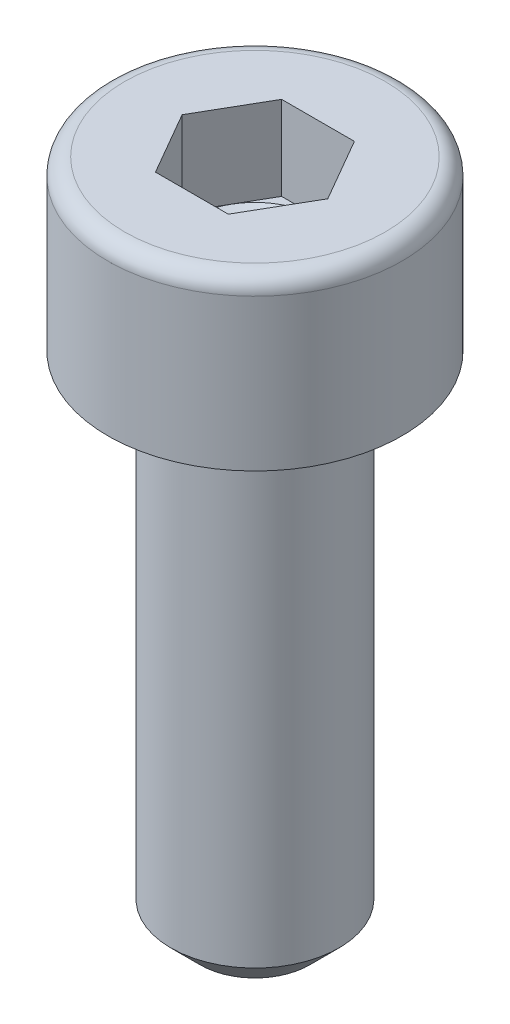
ISO-10303-21;
HEADER;
FILE_DESCRIPTION(('STEP AP214'),'2;1');
FILE_NAME('part.step','',(''),(''),'','','');
FILE_SCHEMA(('AUTOMOTIVE_DESIGN { 1 0 10303 214 1 1 1 1 }'));
ENDSEC;
DATA;
#1=APPLICATION_CONTEXT('core data for automotive mechanical design processes');
#2=APPLICATION_PROTOCOL_DEFINITION('international standard','automotive_design',2000,#1);
#3=PRODUCT_CONTEXT('',#1,'mechanical');
#4=PRODUCT('Part','Part','',(#3));
#5=PRODUCT_RELATED_PRODUCT_CATEGORY('part','',(#4));
#6=PRODUCT_DEFINITION_FORMATION('','',#4);
#7=PRODUCT_DEFINITION_CONTEXT('part definition',#1,'design');
#8=PRODUCT_DEFINITION('design','',#6,#7);
#9=PRODUCT_DEFINITION_SHAPE('','',#8);
#10=(LENGTH_UNIT() NAMED_UNIT(*) SI_UNIT(.MILLI.,.METRE.));
#11=(NAMED_UNIT(*) PLANE_ANGLE_UNIT() SI_UNIT($,.RADIAN.));
#12=(NAMED_UNIT(*) SI_UNIT($,.STERADIAN.) SOLID_ANGLE_UNIT());
#13=UNCERTAINTY_MEASURE_WITH_UNIT(LENGTH_MEASURE(1.E-05),#10,'distance_accuracy_value','');
#14=(GEOMETRIC_REPRESENTATION_CONTEXT(3) GLOBAL_UNCERTAINTY_ASSIGNED_CONTEXT((#13)) GLOBAL_UNIT_ASSIGNED_CONTEXT((#10,
#11,#12)) REPRESENTATION_CONTEXT('',''));
#15=CARTESIAN_POINT('',(0.,0.,0.));
#16=DIRECTION('',(0.,0.,1.));
#17=DIRECTION('',(1.,0.,0.));
#18=AXIS2_PLACEMENT_3D('',#15,#16,#17);
#19=CARTESIAN_POINT('',(1.5,4.,0.));
#20=DIRECTION('',(0.,-1.,0.));
#21=DIRECTION('',(1.,0.,0.));
#22=AXIS2_PLACEMENT_3D('',#19,#20,#21);
#23=PLANE('',#22);
#24=CARTESIAN_POINT('',(0.,4.,0.));
#25=DIRECTION('',(0.,1.,0.));
#26=DIRECTION('',(-1.,0.,0.));
#27=AXIS2_PLACEMENT_3D('',#24,#25,#26);
#28=CIRCLE('',#27,3.1);
#29=CARTESIAN_POINT('',(-3.1,4.,0.));
#30=VERTEX_POINT('',#29);
#31=EDGE_CURVE('E138',#30,#30,#28,.T.);
#32=ORIENTED_EDGE('',*,*,#31,.T.);
#33=EDGE_LOOP('',(#32));
#34=FACE_BOUND('',#33,.T.);
#35=DIRECTION('',(0.499999999999997,0.,0.86602540378444));
#36=VECTOR('',#35,1.);
#37=CARTESIAN_POINT('',(0.866025403784441,4.,-1.5));
#38=LINE('',#37,#36);
#39=CARTESIAN_POINT('',(0.866025403784441,4.,-1.5));
#40=VERTEX_POINT('',#39);
#41=CARTESIAN_POINT('',(1.73205080756887,4.,0.));
#42=VERTEX_POINT('',#41);
#43=EDGE_CURVE('E370',#40,#42,#38,.T.);
#44=ORIENTED_EDGE('',*,*,#43,.T.);
#45=DIRECTION('',(-0.499999999999997,0.,0.86602540378444));
#46=VECTOR('',#45,1.);
#47=CARTESIAN_POINT('',(0.866025403784441,4.,1.5));
#48=LINE('',#47,#46);
#49=CARTESIAN_POINT('',(0.866025403784441,4.,1.5));
#50=VERTEX_POINT('',#49);
#51=EDGE_CURVE('E373',#42,#50,#48,.T.);
#52=ORIENTED_EDGE('',*,*,#51,.T.);
#53=DIRECTION('',(-1.,0.,0.));
#54=VECTOR('',#53,1.);
#55=CARTESIAN_POINT('',(0.866025403784441,4.,1.5));
#56=LINE('',#55,#54);
#57=CARTESIAN_POINT('',(-0.866025403784442,4.,1.5));
#58=VERTEX_POINT('',#57);
#59=EDGE_CURVE('E376',#50,#58,#56,.T.);
#60=ORIENTED_EDGE('',*,*,#59,.T.);
#61=DIRECTION('',(-0.499999999999997,0.,-0.86602540378444));
#62=VECTOR('',#61,1.);
#63=CARTESIAN_POINT('',(-0.866025403784442,4.,1.5));
#64=LINE('',#63,#62);
#65=CARTESIAN_POINT('',(-1.73205080756887,4.,0.));
#66=VERTEX_POINT('',#65);
#67=EDGE_CURVE('E115',#58,#66,#64,.T.);
#68=ORIENTED_EDGE('',*,*,#67,.T.);
#69=DIRECTION('',(0.499999999999998,0.,-0.86602540378444));
#70=VECTOR('',#69,1.);
#71=CARTESIAN_POINT('',(-0.866025403784442,4.,-1.5));
#72=LINE('',#71,#70);
#73=CARTESIAN_POINT('',(-0.866025403784442,4.,-1.5));
#74=VERTEX_POINT('',#73);
#75=EDGE_CURVE('E367',#66,#74,#72,.T.);
#76=ORIENTED_EDGE('',*,*,#75,.T.);
#77=DIRECTION('',(1.,0.,0.));
#78=VECTOR('',#77,1.);
#79=CARTESIAN_POINT('',(0.866025403784441,4.,-1.5));
#80=LINE('',#79,#78);
#81=EDGE_CURVE('E126',#74,#40,#80,.T.);
#82=ORIENTED_EDGE('',*,*,#81,.T.);
#83=EDGE_LOOP('',(#44,#52,#60,#68,#76,#82));
#84=FACE_BOUND('',#83,.T.);
#85=ADVANCED_FACE('F32',(#34,#84),#23,.F.);
#86=CARTESIAN_POINT('',(0.,-12.,0.));
#87=DIRECTION('',(0.,1.,0.));
#88=DIRECTION('',(0.,0.,1.));
#89=AXIS2_PLACEMENT_3D('',#86,#87,#88);
#90=CYLINDRICAL_SURFACE('',#89,2.);
#91=CARTESIAN_POINT('',(0.,-11.3,0.));
#92=DIRECTION('',(0.,1.,0.));
#93=DIRECTION('',(0.,0.,1.));
#94=AXIS2_PLACEMENT_3D('',#91,#92,#93);
#95=CIRCLE('',#94,2.);
#96=CARTESIAN_POINT('',(0.,-11.3,2.));
#97=VERTEX_POINT('',#96);
#98=EDGE_CURVE('E40',#97,#97,#95,.T.);
#99=ORIENTED_EDGE('',*,*,#98,.T.);
#100=EDGE_LOOP('',(#99));
#101=FACE_BOUND('',#100,.T.);
#102=CARTESIAN_POINT('',(0.,0.,0.));
#103=DIRECTION('',(0.,1.,0.));
#104=DIRECTION('',(0.,0.,1.));
#105=AXIS2_PLACEMENT_3D('',#102,#103,#104);
#106=CIRCLE('',#105,2.);
#107=CARTESIAN_POINT('',(0.,0.,2.));
#108=VERTEX_POINT('',#107);
#109=EDGE_CURVE('E148',#108,#108,#106,.T.);
#110=ORIENTED_EDGE('',*,*,#109,.F.);
#111=EDGE_LOOP('',(#110));
#112=FACE_BOUND('',#111,.T.);
#113=ADVANCED_FACE('F153',(#101,#112),#90,.T.);
#114=CARTESIAN_POINT('',(0.,-12.,0.));
#115=DIRECTION('',(0.,1.,0.));
#116=DIRECTION('',(0.,0.,1.));
#117=AXIS2_PLACEMENT_3D('',#114,#115,#116);
#118=PLANE('',#117);
#119=CARTESIAN_POINT('',(0.,-12.,0.));
#120=DIRECTION('',(0.,1.,0.));
#121=DIRECTION('',(0.,0.,1.));
#122=AXIS2_PLACEMENT_3D('',#119,#120,#121);
#123=CIRCLE('',#122,1.3);
#124=CARTESIAN_POINT('',(0.,-12.,1.3));
#125=VERTEX_POINT('',#124);
#126=EDGE_CURVE('E11',#125,#125,#123,.F.);
#127=ORIENTED_EDGE('',*,*,#126,.T.);
#128=EDGE_LOOP('',(#127));
#129=FACE_BOUND('',#128,.T.);
#130=ADVANCED_FACE('F158',(#129),#118,.F.);
#131=CARTESIAN_POINT('',(0.,-11.3,0.));
#132=DIRECTION('',(0.,1.,0.));
#133=DIRECTION('',(0.,0.,1.));
#134=AXIS2_PLACEMENT_3D('',#131,#132,#133);
#135=CONICAL_SURFACE('',#134,2.,0.785398163397448);
#136=ORIENTED_EDGE('',*,*,#126,.F.);
#137=EDGE_LOOP('',(#136));
#138=FACE_BOUND('',#137,.T.);
#139=ORIENTED_EDGE('',*,*,#98,.F.);
#140=EDGE_LOOP('',(#139));
#141=FACE_BOUND('',#140,.T.);
#142=ADVANCED_FACE('F34',(#138,#141),#135,.T.);
#143=CARTESIAN_POINT('',(0.,0.,0.));
#144=DIRECTION('',(0.,1.,0.));
#145=DIRECTION('',(-1.,0.,0.));
#146=AXIS2_PLACEMENT_3D('',#143,#144,#145);
#147=PLANE('',#146);
#148=ORIENTED_EDGE('',*,*,#109,.T.);
#149=EDGE_LOOP('',(#148));
#150=FACE_BOUND('',#149,.T.);
#151=CARTESIAN_POINT('',(0.,0.,0.));
#152=DIRECTION('',(0.,1.,0.));
#153=DIRECTION('',(-1.,0.,0.));
#154=AXIS2_PLACEMENT_3D('',#151,#152,#153);
#155=CIRCLE('',#154,3.5);
#156=CARTESIAN_POINT('',(-3.5,0.,0.));
#157=VERTEX_POINT('',#156);
#158=EDGE_CURVE('E145',#157,#157,#155,.T.);
#159=ORIENTED_EDGE('',*,*,#158,.F.);
#160=EDGE_LOOP('',(#159));
#161=FACE_BOUND('',#160,.T.);
#162=ADVANCED_FACE('F157',(#150,#161),#147,.F.);
#163=CARTESIAN_POINT('',(0.,4.,0.));
#164=DIRECTION('',(0.,1.,0.));
#165=DIRECTION('',(-1.,0.,0.));
#166=AXIS2_PLACEMENT_3D('',#163,#164,#165);
#167=CYLINDRICAL_SURFACE('',#166,3.5);
#168=CARTESIAN_POINT('',(0.,3.6,0.));
#169=DIRECTION('',(0.,1.,0.));
#170=DIRECTION('',(-1.,0.,0.));
#171=AXIS2_PLACEMENT_3D('',#168,#169,#170);
#172=CIRCLE('',#171,3.5);
#173=CARTESIAN_POINT('',(-3.5,3.6,0.));
#174=VERTEX_POINT('',#173);
#175=EDGE_CURVE('E142',#174,#174,#172,.T.);
#176=ORIENTED_EDGE('',*,*,#175,.F.);
#177=EDGE_LOOP('',(#176));
#178=FACE_BOUND('',#177,.T.);
#179=ORIENTED_EDGE('',*,*,#158,.T.);
#180=EDGE_LOOP('',(#179));
#181=FACE_BOUND('',#180,.T.);
#182=ADVANCED_FACE('F164',(#178,#181),#167,.T.);
#183=CARTESIAN_POINT('',(0.,3.6,0.));
#184=DIRECTION('',(0.,1.,0.));
#185=DIRECTION('',(-1.,0.,0.));
#186=AXIS2_PLACEMENT_3D('',#183,#184,#185);
#187=TOROIDAL_SURFACE('',#186,3.1,0.4);
#188=ORIENTED_EDGE('',*,*,#31,.F.);
#189=EDGE_LOOP('',(#188));
#190=FACE_BOUND('',#189,.T.);
#191=ORIENTED_EDGE('',*,*,#175,.T.);
#192=EDGE_LOOP('',(#191));
#193=FACE_BOUND('',#192,.T.);
#194=ADVANCED_FACE('F181',(#190,#193),#187,.T.);
#195=CARTESIAN_POINT('',(-0.866025403784441,2.,-1.5));
#196=DIRECTION('',(0.86602540378444,0.,0.499999999999998));
#197=DIRECTION('',(0.499999999999998,0.,-0.86602540378444));
#198=AXIS2_PLACEMENT_3D('',#195,#196,#197);
#199=PLANE('',#198);
#200=ORIENTED_EDGE('',*,*,#75,.F.);
#201=DIRECTION('',(0.,1.,0.));
#202=VECTOR('',#201,1.);
#203=CARTESIAN_POINT('',(-1.73205080756887,2.,0.));
#204=LINE('',#203,#202);
#205=CARTESIAN_POINT('',(-1.73205080756887,2.,0.));
#206=VERTEX_POINT('',#205);
#207=EDGE_CURVE('E362',#206,#66,#204,.T.);
#208=ORIENTED_EDGE('',*,*,#207,.F.);
#209=DIRECTION('',(0.499999999999998,0.,-0.86602540378444));
#210=VECTOR('',#209,1.);
#211=CARTESIAN_POINT('',(-0.866025403784441,2.,-1.5));
#212=LINE('',#211,#210);
#213=CARTESIAN_POINT('',(-1.29903810567666,2.,-0.749999999999997));
#214=VERTEX_POINT('',#213);
#215=EDGE_CURVE('E111',#206,#214,#212,.T.);
#216=ORIENTED_EDGE('',*,*,#215,.T.);
#217=CARTESIAN_POINT('',(-0.866025403784441,2.,-1.5));
#218=VERTEX_POINT('',#217);
#219=EDGE_CURVE('E105',#214,#218,#212,.T.);
#220=ORIENTED_EDGE('',*,*,#219,.T.);
#221=DIRECTION('',(0.,1.,0.));
#222=VECTOR('',#221,1.);
#223=CARTESIAN_POINT('',(-0.866025403784441,2.,-1.5));
#224=LINE('',#223,#222);
#225=EDGE_CURVE('E107',#218,#74,#224,.T.);
#226=ORIENTED_EDGE('',*,*,#225,.T.);
#227=EDGE_LOOP('',(#200,#208,#216,#220,#226));
#228=FACE_BOUND('',#227,.T.);
#229=ADVANCED_FACE('F106',(#228),#199,.T.);
#230=CARTESIAN_POINT('',(0.866025403784442,2.,-1.5));
#231=DIRECTION('',(0.,0.,1.));
#232=DIRECTION('',(1.,0.,0.));
#233=AXIS2_PLACEMENT_3D('',#230,#231,#232);
#234=PLANE('',#233);
#235=ORIENTED_EDGE('',*,*,#81,.F.);
#236=ORIENTED_EDGE('',*,*,#225,.F.);
#237=DIRECTION('',(1.,0.,0.));
#238=VECTOR('',#237,1.);
#239=CARTESIAN_POINT('',(0.866025403784442,2.,-1.5));
#240=LINE('',#239,#238);
#241=CARTESIAN_POINT('',(0.,2.,-1.5));
#242=VERTEX_POINT('',#241);
#243=EDGE_CURVE('E47',#218,#242,#240,.T.);
#244=ORIENTED_EDGE('',*,*,#243,.T.);
#245=CARTESIAN_POINT('',(0.866025403784442,2.,-1.5));
#246=VERTEX_POINT('',#245);
#247=EDGE_CURVE('E121',#242,#246,#240,.T.);
#248=ORIENTED_EDGE('',*,*,#247,.T.);
#249=DIRECTION('',(0.,1.,0.));
#250=VECTOR('',#249,1.);
#251=CARTESIAN_POINT('',(0.866025403784442,2.,-1.5));
#252=LINE('',#251,#250);
#253=EDGE_CURVE('E128',#246,#40,#252,.T.);
#254=ORIENTED_EDGE('',*,*,#253,.T.);
#255=EDGE_LOOP('',(#235,#236,#244,#248,#254));
#256=FACE_BOUND('',#255,.T.);
#257=ADVANCED_FACE('F123',(#256),#234,.T.);
#258=CARTESIAN_POINT('',(0.866025403784442,2.,-1.5));
#259=DIRECTION('',(-0.86602540378444,0.,0.499999999999997));
#260=DIRECTION('',(0.499999999999997,0.,0.86602540378444));
#261=AXIS2_PLACEMENT_3D('',#258,#259,#260);
#262=PLANE('',#261);
#263=ORIENTED_EDGE('',*,*,#43,.F.);
#264=ORIENTED_EDGE('',*,*,#253,.F.);
#265=DIRECTION('',(0.499999999999997,0.,0.86602540378444));
#266=VECTOR('',#265,1.);
#267=CARTESIAN_POINT('',(0.866025403784442,2.,-1.5));
#268=LINE('',#267,#266);
#269=CARTESIAN_POINT('',(1.29903810567666,2.,-0.749999999999996));
#270=VERTEX_POINT('',#269);
#271=EDGE_CURVE('E395',#246,#270,#268,.T.);
#272=ORIENTED_EDGE('',*,*,#271,.T.);
#273=CARTESIAN_POINT('',(1.73205080756887,2.,0.));
#274=VERTEX_POINT('',#273);
#275=EDGE_CURVE('E120',#270,#274,#268,.T.);
#276=ORIENTED_EDGE('',*,*,#275,.T.);
#277=DIRECTION('',(0.,1.,0.));
#278=VECTOR('',#277,1.);
#279=CARTESIAN_POINT('',(1.73205080756887,2.,0.));
#280=LINE('',#279,#278);
#281=EDGE_CURVE('E133',#274,#42,#280,.T.);
#282=ORIENTED_EDGE('',*,*,#281,.T.);
#283=EDGE_LOOP('',(#263,#264,#272,#276,#282));
#284=FACE_BOUND('',#283,.T.);
#285=ADVANCED_FACE('F211',(#284),#262,.T.);
#286=CARTESIAN_POINT('',(0.866025403784441,2.,1.5));
#287=DIRECTION('',(-0.86602540378444,0.,-0.499999999999997));
#288=DIRECTION('',(-0.499999999999997,0.,0.86602540378444));
#289=AXIS2_PLACEMENT_3D('',#286,#287,#288);
#290=PLANE('',#289);
#291=ORIENTED_EDGE('',*,*,#51,.F.);
#292=ORIENTED_EDGE('',*,*,#281,.F.);
#293=DIRECTION('',(-0.499999999999997,0.,0.86602540378444));
#294=VECTOR('',#293,1.);
#295=CARTESIAN_POINT('',(0.866025403784441,2.,1.5));
#296=LINE('',#295,#294);
#297=CARTESIAN_POINT('',(1.29903810567666,2.,0.749999999999996));
#298=VERTEX_POINT('',#297);
#299=EDGE_CURVE('E393',#274,#298,#296,.T.);
#300=ORIENTED_EDGE('',*,*,#299,.T.);
#301=CARTESIAN_POINT('',(0.866025403784441,2.,1.5));
#302=VERTEX_POINT('',#301);
#303=EDGE_CURVE('E394',#298,#302,#296,.T.);
#304=ORIENTED_EDGE('',*,*,#303,.T.);
#305=DIRECTION('',(0.,1.,0.));
#306=VECTOR('',#305,1.);
#307=CARTESIAN_POINT('',(0.866025403784441,2.,1.5));
#308=LINE('',#307,#306);
#309=EDGE_CURVE('E382',#302,#50,#308,.T.);
#310=ORIENTED_EDGE('',*,*,#309,.T.);
#311=EDGE_LOOP('',(#291,#292,#300,#304,#310));
#312=FACE_BOUND('',#311,.T.);
#313=ADVANCED_FACE('F218',(#312),#290,.T.);
#314=CARTESIAN_POINT('',(0.866025403784441,2.,1.5));
#315=DIRECTION('',(0.,0.,-1.));
#316=DIRECTION('',(-1.,0.,0.));
#317=AXIS2_PLACEMENT_3D('',#314,#315,#316);
#318=PLANE('',#317);
#319=ORIENTED_EDGE('',*,*,#59,.F.);
#320=ORIENTED_EDGE('',*,*,#309,.F.);
#321=DIRECTION('',(-1.,0.,0.));
#322=VECTOR('',#321,1.);
#323=CARTESIAN_POINT('',(0.866025403784441,2.,1.5));
#324=LINE('',#323,#322);
#325=CARTESIAN_POINT('',(0.,2.,1.5));
#326=VERTEX_POINT('',#325);
#327=EDGE_CURVE('E357',#302,#326,#324,.T.);
#328=ORIENTED_EDGE('',*,*,#327,.T.);
#329=CARTESIAN_POINT('',(-0.866025403784442,2.,1.5));
#330=VERTEX_POINT('',#329);
#331=EDGE_CURVE('E353',#326,#330,#324,.T.);
#332=ORIENTED_EDGE('',*,*,#331,.T.);
#333=DIRECTION('',(0.,1.,0.));
#334=VECTOR('',#333,1.);
#335=CARTESIAN_POINT('',(-0.866025403784442,2.,1.5));
#336=LINE('',#335,#334);
#337=EDGE_CURVE('E361',#330,#58,#336,.T.);
#338=ORIENTED_EDGE('',*,*,#337,.T.);
#339=EDGE_LOOP('',(#319,#320,#328,#332,#338));
#340=FACE_BOUND('',#339,.T.);
#341=ADVANCED_FACE('F226',(#340),#318,.T.);
#342=CARTESIAN_POINT('',(-0.866025403784442,2.,1.5));
#343=DIRECTION('',(0.86602540378444,0.,-0.499999999999997));
#344=DIRECTION('',(-0.499999999999997,0.,-0.86602540378444));
#345=AXIS2_PLACEMENT_3D('',#342,#343,#344);
#346=PLANE('',#345);
#347=ORIENTED_EDGE('',*,*,#67,.F.);
#348=ORIENTED_EDGE('',*,*,#337,.F.);
#349=DIRECTION('',(-0.499999999999997,0.,-0.86602540378444));
#350=VECTOR('',#349,1.);
#351=CARTESIAN_POINT('',(-0.866025403784442,2.,1.5));
#352=LINE('',#351,#350);
#353=CARTESIAN_POINT('',(-1.29903810567666,2.,0.749999999999995));
#354=VERTEX_POINT('',#353);
#355=EDGE_CURVE('E352',#330,#354,#352,.T.);
#356=ORIENTED_EDGE('',*,*,#355,.T.);
#357=EDGE_CURVE('E355',#354,#206,#352,.T.);
#358=ORIENTED_EDGE('',*,*,#357,.T.);
#359=ORIENTED_EDGE('',*,*,#207,.T.);
#360=EDGE_LOOP('',(#347,#348,#356,#358,#359));
#361=FACE_BOUND('',#360,.T.);
#362=ADVANCED_FACE('F234',(#361),#346,.T.);
#363=CARTESIAN_POINT('',(-2.59807621135331,2.,1.5));
#364=DIRECTION('',(0.,-1.,0.));
#365=DIRECTION('',(0.,0.,-1.));
#366=AXIS2_PLACEMENT_3D('',#363,#364,#365);
#367=PLANE('',#366);
#368=ORIENTED_EDGE('',*,*,#243,.F.);
#369=ORIENTED_EDGE('',*,*,#219,.F.);
#370=CARTESIAN_POINT('',(0.,2.,0.));
#371=DIRECTION('',(0.,1.,0.));
#372=DIRECTION('',(-1.,0.,0.));
#373=AXIS2_PLACEMENT_3D('',#370,#371,#372);
#374=CIRCLE('',#373,1.5);
#375=EDGE_CURVE('E118',#242,#214,#374,.T.);
#376=ORIENTED_EDGE('',*,*,#375,.F.);
#377=EDGE_LOOP('',(#368,#369,#376));
#378=FACE_BOUND('',#377,.T.);
#379=ADVANCED_FACE('F117',(#378),#367,.F.);
#380=ORIENTED_EDGE('',*,*,#215,.F.);
#381=ORIENTED_EDGE('',*,*,#357,.F.);
#382=EDGE_CURVE('E127',#214,#354,#374,.T.);
#383=ORIENTED_EDGE('',*,*,#382,.F.);
#384=EDGE_LOOP('',(#380,#381,#383));
#385=FACE_BOUND('',#384,.T.);
#386=ADVANCED_FACE('F249',(#385),#367,.F.);
#387=ORIENTED_EDGE('',*,*,#355,.F.);
#388=ORIENTED_EDGE('',*,*,#331,.F.);
#389=EDGE_CURVE('E132',#354,#326,#374,.T.);
#390=ORIENTED_EDGE('',*,*,#389,.F.);
#391=EDGE_LOOP('',(#387,#388,#390));
#392=FACE_BOUND('',#391,.T.);
#393=ADVANCED_FACE('F257',(#392),#367,.F.);
#394=ORIENTED_EDGE('',*,*,#327,.F.);
#395=ORIENTED_EDGE('',*,*,#303,.F.);
#396=EDGE_CURVE('E139',#326,#298,#374,.T.);
#397=ORIENTED_EDGE('',*,*,#396,.F.);
#398=EDGE_LOOP('',(#394,#395,#397));
#399=FACE_BOUND('',#398,.T.);
#400=ADVANCED_FACE('F264',(#399),#367,.F.);
#401=ORIENTED_EDGE('',*,*,#299,.F.);
#402=ORIENTED_EDGE('',*,*,#275,.F.);
#403=EDGE_CURVE('E399',#298,#270,#374,.T.);
#404=ORIENTED_EDGE('',*,*,#403,.F.);
#405=EDGE_LOOP('',(#401,#402,#404));
#406=FACE_BOUND('',#405,.T.);
#407=ADVANCED_FACE('F271',(#406),#367,.F.);
#408=ORIENTED_EDGE('',*,*,#271,.F.);
#409=ORIENTED_EDGE('',*,*,#247,.F.);
#410=EDGE_CURVE('E398',#270,#242,#374,.T.);
#411=ORIENTED_EDGE('',*,*,#410,.F.);
#412=EDGE_LOOP('',(#408,#409,#411));
#413=FACE_BOUND('',#412,.T.);
#414=ADVANCED_FACE('F251',(#413),#367,.F.);
#415=CARTESIAN_POINT('',(0.,2.,0.));
#416=DIRECTION('',(0.,1.,0.));
#417=DIRECTION('',(-1.,0.,0.));
#418=AXIS2_PLACEMENT_3D('',#415,#416,#417);
#419=CONICAL_SURFACE('',#418,1.5,1.04719755119659);
#420=CARTESIAN_POINT('',(0.,1.13397459621555,0.));
#421=VERTEX_POINT('',#420);
#422=VERTEX_LOOP('',#421);
#423=FACE_BOUND('',#422,.T.);
#424=ORIENTED_EDGE('',*,*,#389,.T.);
#425=ORIENTED_EDGE('',*,*,#396,.T.);
#426=ORIENTED_EDGE('',*,*,#403,.T.);
#427=ORIENTED_EDGE('',*,*,#410,.T.);
#428=ORIENTED_EDGE('',*,*,#375,.T.);
#429=ORIENTED_EDGE('',*,*,#382,.T.);
#430=EDGE_LOOP('',(#424,#425,#426,#427,#428,#429));
#431=FACE_BOUND('',#430,.T.);
#432=ADVANCED_FACE('F179',(#423,#431),#419,.F.);
#433=CLOSED_SHELL('',(#85,#113,#130,#142,#162,#182,#194,#229,#257,#285,#313,#341,#362,#379,#386,
#393,#400,#407,#414,#432));
#434=MANIFOLD_SOLID_BREP('B2',#433);
#435=ADVANCED_BREP_SHAPE_REPRESENTATION('',(#18,#434),#14);
#436=SHAPE_DEFINITION_REPRESENTATION(#9,#435);
ENDSEC;
END-ISO-10303-21;
